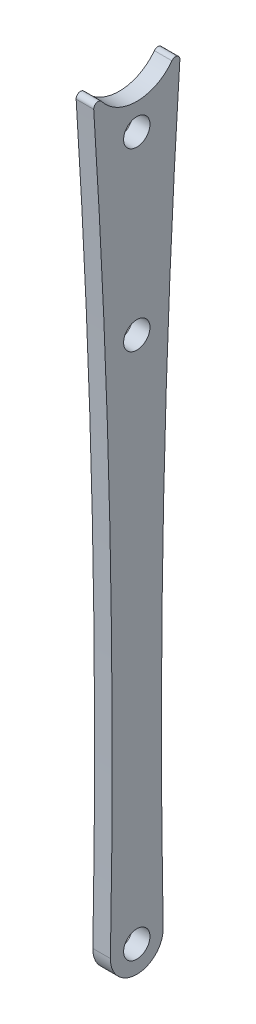
ISO-10303-21;
HEADER;
FILE_DESCRIPTION(('STEP AP214'),'2;1');
FILE_NAME('part.step','',(''),(''),'','','');
FILE_SCHEMA(('AUTOMOTIVE_DESIGN { 1 0 10303 214 1 1 1 1 }'));
ENDSEC;
DATA;
#1=APPLICATION_CONTEXT('core data for automotive mechanical design processes');
#2=APPLICATION_PROTOCOL_DEFINITION('international standard','automotive_design',2000,#1);
#3=PRODUCT_CONTEXT('',#1,'mechanical');
#4=PRODUCT('Part','Part','',(#3));
#5=PRODUCT_RELATED_PRODUCT_CATEGORY('part','',(#4));
#6=PRODUCT_DEFINITION_FORMATION('','',#4);
#7=PRODUCT_DEFINITION_CONTEXT('part definition',#1,'design');
#8=PRODUCT_DEFINITION('design','',#6,#7);
#9=PRODUCT_DEFINITION_SHAPE('','',#8);
#10=(LENGTH_UNIT() NAMED_UNIT(*) SI_UNIT(.MILLI.,.METRE.));
#11=(NAMED_UNIT(*) PLANE_ANGLE_UNIT() SI_UNIT($,.RADIAN.));
#12=(NAMED_UNIT(*) SI_UNIT($,.STERADIAN.) SOLID_ANGLE_UNIT());
#13=UNCERTAINTY_MEASURE_WITH_UNIT(LENGTH_MEASURE(1.E-05),#10,'distance_accuracy_value','');
#14=(GEOMETRIC_REPRESENTATION_CONTEXT(3) GLOBAL_UNCERTAINTY_ASSIGNED_CONTEXT((#13)) GLOBAL_UNIT_ASSIGNED_CONTEXT((#10,
#11,#12)) REPRESENTATION_CONTEXT('',''));
#15=CARTESIAN_POINT('',(0.,0.,0.));
#16=DIRECTION('',(0.,0.,1.));
#17=DIRECTION('',(1.,0.,0.));
#18=AXIS2_PLACEMENT_3D('',#15,#16,#17);
#19=CARTESIAN_POINT('',(2.,52.3191384121453,-503.600903748008));
#20=DIRECTION('',(-1.,0.,0.));
#21=DIRECTION('',(0.,0.,1.));
#22=AXIS2_PLACEMENT_3D('',#19,#20,#21);
#23=PLANE('',#22);
#24=CARTESIAN_POINT('',(2.,19.9382768242907,-1002.80180749602));
#25=DIRECTION('',(-1.,0.,0.));
#26=DIRECTION('',(0.,0.,1.));
#27=AXIS2_PLACEMENT_3D('',#24,#25,#26);
#28=CIRCLE('',#27,1000.);
#29=CARTESIAN_POINT('',(2.,0.0596359227047606,-2.99940720088548));
#30=VERTEX_POINT('',#29);
#31=CARTESIAN_POINT('',(2.,84.6676353207518,-4.8989514280341));
#32=VERTEX_POINT('',#31);
#33=EDGE_CURVE('E140',#30,#32,#28,.T.);
#34=ORIENTED_EDGE('',*,*,#33,.T.);
#35=CARTESIAN_POINT('',(2.,84.7,-4.4));
#36=DIRECTION('',(1.,0.,0.));
#37=DIRECTION('',(0.,0.,-1.));
#38=AXIS2_PLACEMENT_3D('',#35,#36,#37);
#39=CIRCLE('',#38,0.500000000000106);
#40=CARTESIAN_POINT('',(2.,85.,-4.));
#41=VERTEX_POINT('',#40);
#42=EDGE_CURVE('E92',#32,#41,#39,.T.);
#43=ORIENTED_EDGE('',*,*,#42,.T.);
#44=CARTESIAN_POINT('',(2.,88.,0.));
#45=DIRECTION('',(-1.,0.,0.));
#46=DIRECTION('',(0.,0.,1.));
#47=AXIS2_PLACEMENT_3D('',#44,#45,#46);
#48=CIRCLE('',#47,5.);
#49=CARTESIAN_POINT('',(2.,85.0000000000001,3.99999999999991));
#50=VERTEX_POINT('',#49);
#51=EDGE_CURVE('E107',#41,#50,#48,.T.);
#52=ORIENTED_EDGE('',*,*,#51,.T.);
#53=CARTESIAN_POINT('',(2.,84.7,4.4));
#54=DIRECTION('',(1.,0.,0.));
#55=DIRECTION('',(0.,0.,1.));
#56=AXIS2_PLACEMENT_3D('',#53,#54,#55);
#57=CIRCLE('',#56,0.500000000000106);
#58=CARTESIAN_POINT('',(2.,84.6676353207514,4.8989514280342));
#59=VERTEX_POINT('',#58);
#60=EDGE_CURVE('E105',#50,#59,#57,.T.);
#61=ORIENTED_EDGE('',*,*,#60,.T.);
#62=CARTESIAN_POINT('',(2.,19.9382768242907,1002.80180749602));
#63=DIRECTION('',(-1.,0.,0.));
#64=DIRECTION('',(0.,0.,-1.));
#65=AXIS2_PLACEMENT_3D('',#62,#63,#64);
#66=CIRCLE('',#65,1000.);
#67=CARTESIAN_POINT('',(2.,0.0596359227047596,2.99940720088548));
#68=VERTEX_POINT('',#67);
#69=EDGE_CURVE('E106',#59,#68,#66,.T.);
#70=ORIENTED_EDGE('',*,*,#69,.T.);
#71=CARTESIAN_POINT('',(2.,0.,0.));
#72=DIRECTION('',(1.,0.,0.));
#73=DIRECTION('',(0.,0.,-1.));
#74=AXIS2_PLACEMENT_3D('',#71,#72,#73);
#75=CIRCLE('',#74,3.00000000000008);
#76=EDGE_CURVE('E59',#68,#30,#75,.T.);
#77=ORIENTED_EDGE('',*,*,#76,.T.);
#78=EDGE_LOOP('',(#34,#43,#52,#61,#70,#77));
#79=FACE_BOUND('',#78,.T.);
#80=CARTESIAN_POINT('',(2.,0.,0.));
#81=DIRECTION('',(1.,0.,0.));
#82=DIRECTION('',(0.,0.,-1.));
#83=AXIS2_PLACEMENT_3D('',#80,#81,#82);
#84=CIRCLE('',#83,1.5);
#85=CARTESIAN_POINT('',(2.,0.,-1.5));
#86=VERTEX_POINT('',#85);
#87=EDGE_CURVE('E128',#86,#86,#84,.T.);
#88=ORIENTED_EDGE('',*,*,#87,.F.);
#89=EDGE_LOOP('',(#88));
#90=FACE_BOUND('',#89,.T.);
#91=CARTESIAN_POINT('',(2.,60.,0.));
#92=DIRECTION('',(1.,0.,0.));
#93=DIRECTION('',(0.,0.,-1.));
#94=AXIS2_PLACEMENT_3D('',#91,#92,#93);
#95=CIRCLE('',#94,1.5);
#96=CARTESIAN_POINT('',(2.,60.,-1.5));
#97=VERTEX_POINT('',#96);
#98=EDGE_CURVE('E192',#97,#97,#95,.T.);
#99=ORIENTED_EDGE('',*,*,#98,.F.);
#100=EDGE_LOOP('',(#99));
#101=FACE_BOUND('',#100,.T.);
#102=CARTESIAN_POINT('',(2.,80.,0.));
#103=DIRECTION('',(1.,0.,0.));
#104=DIRECTION('',(0.,0.,-1.));
#105=AXIS2_PLACEMENT_3D('',#102,#103,#104);
#106=CIRCLE('',#105,1.5);
#107=CARTESIAN_POINT('',(2.,80.,-1.5));
#108=VERTEX_POINT('',#107);
#109=EDGE_CURVE('E185',#108,#108,#106,.T.);
#110=ORIENTED_EDGE('',*,*,#109,.F.);
#111=EDGE_LOOP('',(#110));
#112=FACE_BOUND('',#111,.T.);
#113=ADVANCED_FACE('F41',(#79,#90,#101,#112),#23,.F.);
#114=CARTESIAN_POINT('',(0.,52.3191384121453,-503.600903748008));
#115=DIRECTION('',(-1.,0.,0.));
#116=DIRECTION('',(0.,0.,1.));
#117=AXIS2_PLACEMENT_3D('',#114,#115,#116);
#118=PLANE('',#117);
#119=CARTESIAN_POINT('',(0.,60.,0.));
#120=DIRECTION('',(1.,0.,0.));
#121=DIRECTION('',(0.,0.,-1.));
#122=AXIS2_PLACEMENT_3D('',#119,#120,#121);
#123=CIRCLE('',#122,1.5);
#124=CARTESIAN_POINT('',(0.,60.,-1.5));
#125=VERTEX_POINT('',#124);
#126=EDGE_CURVE('E187',#125,#125,#123,.T.);
#127=ORIENTED_EDGE('',*,*,#126,.T.);
#128=EDGE_LOOP('',(#127));
#129=FACE_BOUND('',#128,.T.);
#130=CARTESIAN_POINT('',(0.,19.9382768242907,-1002.80180749602));
#131=DIRECTION('',(-1.,0.,0.));
#132=DIRECTION('',(0.,0.,1.));
#133=AXIS2_PLACEMENT_3D('',#130,#131,#132);
#134=CIRCLE('',#133,1000.);
#135=CARTESIAN_POINT('',(0.,0.0596359227047606,-2.99940720088548));
#136=VERTEX_POINT('',#135);
#137=CARTESIAN_POINT('',(0.,84.6676353207518,-4.8989514280341));
#138=VERTEX_POINT('',#137);
#139=EDGE_CURVE('E127',#136,#138,#134,.T.);
#140=ORIENTED_EDGE('',*,*,#139,.F.);
#141=CARTESIAN_POINT('',(0.,0.,0.));
#142=DIRECTION('',(1.,0.,0.));
#143=DIRECTION('',(0.,0.,-1.));
#144=AXIS2_PLACEMENT_3D('',#141,#142,#143);
#145=CIRCLE('',#144,3.00000000000008);
#146=CARTESIAN_POINT('',(0.,0.0596359227047596,2.99940720088548));
#147=VERTEX_POINT('',#146);
#148=EDGE_CURVE('E87',#147,#136,#145,.T.);
#149=ORIENTED_EDGE('',*,*,#148,.F.);
#150=CARTESIAN_POINT('',(0.,19.9382768242907,1002.80180749602));
#151=DIRECTION('',(-1.,0.,0.));
#152=DIRECTION('',(0.,0.,-1.));
#153=AXIS2_PLACEMENT_3D('',#150,#151,#152);
#154=CIRCLE('',#153,1000.);
#155=CARTESIAN_POINT('',(0.,84.6676353207514,4.8989514280342));
#156=VERTEX_POINT('',#155);
#157=EDGE_CURVE('E82',#156,#147,#154,.T.);
#158=ORIENTED_EDGE('',*,*,#157,.F.);
#159=CARTESIAN_POINT('',(0.,84.7,4.4));
#160=DIRECTION('',(1.,0.,0.));
#161=DIRECTION('',(0.,0.,1.));
#162=AXIS2_PLACEMENT_3D('',#159,#160,#161);
#163=CIRCLE('',#162,0.500000000000106);
#164=CARTESIAN_POINT('',(0.,85.0000000000001,3.99999999999991));
#165=VERTEX_POINT('',#164);
#166=EDGE_CURVE('E118',#165,#156,#163,.T.);
#167=ORIENTED_EDGE('',*,*,#166,.F.);
#168=CARTESIAN_POINT('',(0.,88.,0.));
#169=DIRECTION('',(-1.,0.,0.));
#170=DIRECTION('',(0.,0.,1.));
#171=AXIS2_PLACEMENT_3D('',#168,#169,#170);
#172=CIRCLE('',#171,5.);
#173=CARTESIAN_POINT('',(0.,85.,-4.));
#174=VERTEX_POINT('',#173);
#175=EDGE_CURVE('E134',#174,#165,#172,.T.);
#176=ORIENTED_EDGE('',*,*,#175,.F.);
#177=CARTESIAN_POINT('',(0.,84.7,-4.4));
#178=DIRECTION('',(1.,0.,0.));
#179=DIRECTION('',(0.,0.,-1.));
#180=AXIS2_PLACEMENT_3D('',#177,#178,#179);
#181=CIRCLE('',#180,0.500000000000106);
#182=EDGE_CURVE('E129',#138,#174,#181,.T.);
#183=ORIENTED_EDGE('',*,*,#182,.F.);
#184=EDGE_LOOP('',(#140,#149,#158,#167,#176,#183));
#185=FACE_BOUND('',#184,.T.);
#186=CARTESIAN_POINT('',(0.,0.,0.));
#187=DIRECTION('',(1.,0.,0.));
#188=DIRECTION('',(0.,0.,-1.));
#189=AXIS2_PLACEMENT_3D('',#186,#187,#188);
#190=CIRCLE('',#189,1.5);
#191=CARTESIAN_POINT('',(0.,0.,-1.5));
#192=VERTEX_POINT('',#191);
#193=EDGE_CURVE('E191',#192,#192,#190,.T.);
#194=ORIENTED_EDGE('',*,*,#193,.T.);
#195=EDGE_LOOP('',(#194));
#196=FACE_BOUND('',#195,.T.);
#197=CARTESIAN_POINT('',(0.,80.,0.));
#198=DIRECTION('',(1.,0.,0.));
#199=DIRECTION('',(0.,0.,-1.));
#200=AXIS2_PLACEMENT_3D('',#197,#198,#199);
#201=CIRCLE('',#200,1.5);
#202=CARTESIAN_POINT('',(0.,80.,-1.5));
#203=VERTEX_POINT('',#202);
#204=EDGE_CURVE('E183',#203,#203,#201,.T.);
#205=ORIENTED_EDGE('',*,*,#204,.T.);
#206=EDGE_LOOP('',(#205));
#207=FACE_BOUND('',#206,.T.);
#208=ADVANCED_FACE('F148',(#129,#185,#196,#207),#118,.T.);
#209=CARTESIAN_POINT('',(2.,19.9382768242907,-1002.80180749602));
#210=DIRECTION('',(-1.,0.,0.));
#211=DIRECTION('',(0.,0.,1.));
#212=AXIS2_PLACEMENT_3D('',#209,#210,#211);
#213=CYLINDRICAL_SURFACE('',#212,1000.);
#214=ORIENTED_EDGE('',*,*,#139,.T.);
#215=DIRECTION('',(-1.,0.,0.));
#216=VECTOR('',#215,1.);
#217=CARTESIAN_POINT('',(2.,84.6676353207518,-4.8989514280341));
#218=LINE('',#217,#216);
#219=EDGE_CURVE('E11',#32,#138,#218,.T.);
#220=ORIENTED_EDGE('',*,*,#219,.F.);
#221=ORIENTED_EDGE('',*,*,#33,.F.);
#222=DIRECTION('',(-1.,0.,0.));
#223=VECTOR('',#222,1.);
#224=CARTESIAN_POINT('',(2.,0.0596359227047606,-2.99940720088548));
#225=LINE('',#224,#223);
#226=EDGE_CURVE('E125',#30,#136,#225,.T.);
#227=ORIENTED_EDGE('',*,*,#226,.T.);
#228=EDGE_LOOP('',(#214,#220,#221,#227));
#229=FACE_BOUND('',#228,.T.);
#230=ADVANCED_FACE('F43',(#229),#213,.F.);
#231=CARTESIAN_POINT('',(2.,84.7,-4.4));
#232=DIRECTION('',(-1.,0.,0.));
#233=DIRECTION('',(0.,0.,1.));
#234=AXIS2_PLACEMENT_3D('',#231,#232,#233);
#235=CYLINDRICAL_SURFACE('',#234,0.500000000000106);
#236=ORIENTED_EDGE('',*,*,#182,.T.);
#237=DIRECTION('',(-1.,0.,0.));
#238=VECTOR('',#237,1.);
#239=CARTESIAN_POINT('',(2.,85.,-4.));
#240=LINE('',#239,#238);
#241=EDGE_CURVE('E49',#41,#174,#240,.T.);
#242=ORIENTED_EDGE('',*,*,#241,.F.);
#243=ORIENTED_EDGE('',*,*,#42,.F.);
#244=ORIENTED_EDGE('',*,*,#219,.T.);
#245=EDGE_LOOP('',(#236,#242,#243,#244));
#246=FACE_BOUND('',#245,.T.);
#247=ADVANCED_FACE('F249',(#246),#235,.T.);
#248=CARTESIAN_POINT('',(2.,88.,0.));
#249=DIRECTION('',(-1.,0.,0.));
#250=DIRECTION('',(0.,0.,1.));
#251=AXIS2_PLACEMENT_3D('',#248,#249,#250);
#252=CYLINDRICAL_SURFACE('',#251,5.);
#253=ORIENTED_EDGE('',*,*,#175,.T.);
#254=DIRECTION('',(-1.,0.,0.));
#255=VECTOR('',#254,1.);
#256=CARTESIAN_POINT('',(2.,85.0000000000001,3.99999999999991));
#257=LINE('',#256,#255);
#258=EDGE_CURVE('E119',#50,#165,#257,.T.);
#259=ORIENTED_EDGE('',*,*,#258,.F.);
#260=ORIENTED_EDGE('',*,*,#51,.F.);
#261=ORIENTED_EDGE('',*,*,#241,.T.);
#262=EDGE_LOOP('',(#253,#259,#260,#261));
#263=FACE_BOUND('',#262,.T.);
#264=ADVANCED_FACE('F141',(#263),#252,.F.);
#265=CARTESIAN_POINT('',(2.,84.7,4.4));
#266=DIRECTION('',(-1.,0.,0.));
#267=DIRECTION('',(0.,0.,1.));
#268=AXIS2_PLACEMENT_3D('',#265,#266,#267);
#269=CYLINDRICAL_SURFACE('',#268,0.500000000000106);
#270=ORIENTED_EDGE('',*,*,#166,.T.);
#271=DIRECTION('',(-1.,0.,0.));
#272=VECTOR('',#271,1.);
#273=CARTESIAN_POINT('',(2.,84.6676353207514,4.8989514280342));
#274=LINE('',#273,#272);
#275=EDGE_CURVE('E114',#59,#156,#274,.T.);
#276=ORIENTED_EDGE('',*,*,#275,.F.);
#277=ORIENTED_EDGE('',*,*,#60,.F.);
#278=ORIENTED_EDGE('',*,*,#258,.T.);
#279=EDGE_LOOP('',(#270,#276,#277,#278));
#280=FACE_BOUND('',#279,.T.);
#281=ADVANCED_FACE('F111',(#280),#269,.T.);
#282=CARTESIAN_POINT('',(2.,19.9382768242907,1002.80180749602));
#283=DIRECTION('',(-1.,0.,0.));
#284=DIRECTION('',(0.,0.,1.));
#285=AXIS2_PLACEMENT_3D('',#282,#283,#284);
#286=CYLINDRICAL_SURFACE('',#285,1000.);
#287=ORIENTED_EDGE('',*,*,#157,.T.);
#288=DIRECTION('',(-1.,0.,0.));
#289=VECTOR('',#288,1.);
#290=CARTESIAN_POINT('',(2.,0.0596359227047596,2.99940720088548));
#291=LINE('',#290,#289);
#292=EDGE_CURVE('E117',#68,#147,#291,.T.);
#293=ORIENTED_EDGE('',*,*,#292,.F.);
#294=ORIENTED_EDGE('',*,*,#69,.F.);
#295=ORIENTED_EDGE('',*,*,#275,.T.);
#296=EDGE_LOOP('',(#287,#293,#294,#295));
#297=FACE_BOUND('',#296,.T.);
#298=ADVANCED_FACE('F116',(#297),#286,.F.);
#299=CARTESIAN_POINT('',(2.,0.,0.));
#300=DIRECTION('',(-1.,0.,0.));
#301=DIRECTION('',(0.,0.,1.));
#302=AXIS2_PLACEMENT_3D('',#299,#300,#301);
#303=CYLINDRICAL_SURFACE('',#302,3.00000000000008);
#304=ORIENTED_EDGE('',*,*,#148,.T.);
#305=ORIENTED_EDGE('',*,*,#226,.F.);
#306=ORIENTED_EDGE('',*,*,#76,.F.);
#307=ORIENTED_EDGE('',*,*,#292,.T.);
#308=EDGE_LOOP('',(#304,#305,#306,#307));
#309=FACE_BOUND('',#308,.T.);
#310=ADVANCED_FACE('F151',(#309),#303,.T.);
#311=CARTESIAN_POINT('',(2.,0.,0.));
#312=DIRECTION('',(-1.,0.,0.));
#313=DIRECTION('',(0.,0.,1.));
#314=AXIS2_PLACEMENT_3D('',#311,#312,#313);
#315=CYLINDRICAL_SURFACE('',#314,1.5);
#316=ORIENTED_EDGE('',*,*,#87,.T.);
#317=EDGE_LOOP('',(#316));
#318=FACE_BOUND('',#317,.T.);
#319=ORIENTED_EDGE('',*,*,#193,.F.);
#320=EDGE_LOOP('',(#319));
#321=FACE_BOUND('',#320,.T.);
#322=ADVANCED_FACE('F153',(#318,#321),#315,.F.);
#323=CARTESIAN_POINT('',(2.,60.,0.));
#324=DIRECTION('',(-1.,0.,0.));
#325=DIRECTION('',(0.,0.,1.));
#326=AXIS2_PLACEMENT_3D('',#323,#324,#325);
#327=CYLINDRICAL_SURFACE('',#326,1.5);
#328=ORIENTED_EDGE('',*,*,#98,.T.);
#329=EDGE_LOOP('',(#328));
#330=FACE_BOUND('',#329,.T.);
#331=ORIENTED_EDGE('',*,*,#126,.F.);
#332=EDGE_LOOP('',(#331));
#333=FACE_BOUND('',#332,.T.);
#334=ADVANCED_FACE('F157',(#330,#333),#327,.F.);
#335=CARTESIAN_POINT('',(2.,80.,0.));
#336=DIRECTION('',(-1.,0.,0.));
#337=DIRECTION('',(0.,0.,1.));
#338=AXIS2_PLACEMENT_3D('',#335,#336,#337);
#339=CYLINDRICAL_SURFACE('',#338,1.5);
#340=ORIENTED_EDGE('',*,*,#109,.T.);
#341=EDGE_LOOP('',(#340));
#342=FACE_BOUND('',#341,.T.);
#343=ORIENTED_EDGE('',*,*,#204,.F.);
#344=EDGE_LOOP('',(#343));
#345=FACE_BOUND('',#344,.T.);
#346=ADVANCED_FACE('F172',(#342,#345),#339,.F.);
#347=CLOSED_SHELL('',(#113,#208,#230,#247,#264,#281,#298,#310,#322,#334,#346));
#348=MANIFOLD_SOLID_BREP('B2',#347);
#349=ADVANCED_BREP_SHAPE_REPRESENTATION('',(#18,#348),#14);
#350=SHAPE_DEFINITION_REPRESENTATION(#9,#349);
ENDSEC;
END-ISO-10303-21;
